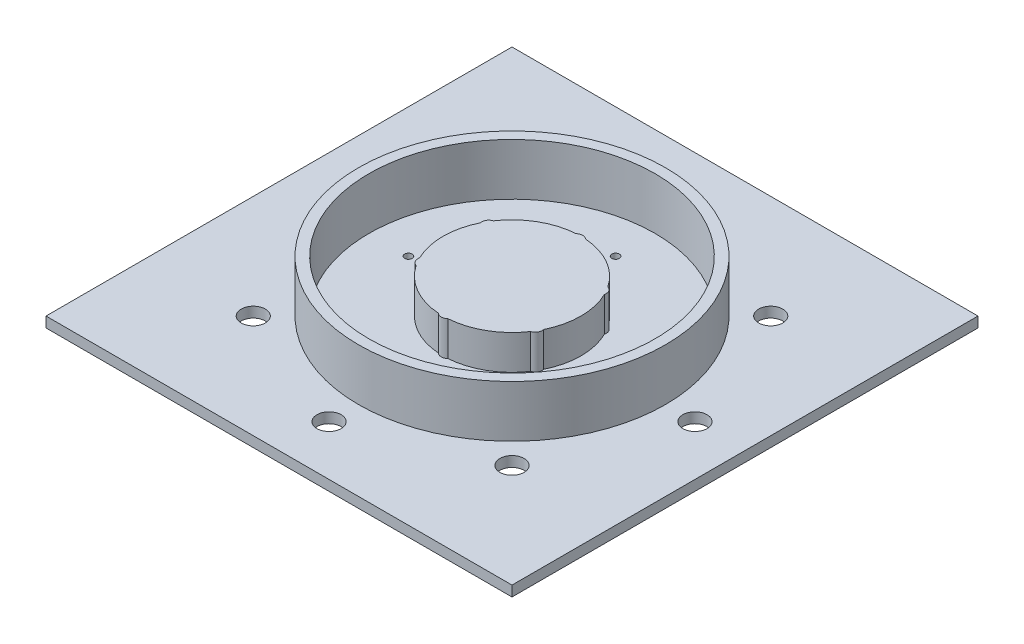
ISO-10303-21;
HEADER;
FILE_DESCRIPTION(('STEP AP214'),'2;1');
FILE_NAME('part.step','',(''),(''),'','','');
FILE_SCHEMA(('AUTOMOTIVE_DESIGN { 1 0 10303 214 1 1 1 1 }'));
ENDSEC;
DATA;
#1=APPLICATION_CONTEXT('core data for automotive mechanical design processes');
#2=APPLICATION_PROTOCOL_DEFINITION('international standard','automotive_design',2000,#1);
#3=PRODUCT_CONTEXT('',#1,'mechanical');
#4=PRODUCT('Part','Part','',(#3));
#5=PRODUCT_RELATED_PRODUCT_CATEGORY('part','',(#4));
#6=PRODUCT_DEFINITION_FORMATION('','',#4);
#7=PRODUCT_DEFINITION_CONTEXT('part definition',#1,'design');
#8=PRODUCT_DEFINITION('design','',#6,#7);
#9=PRODUCT_DEFINITION_SHAPE('','',#8);
#10=(LENGTH_UNIT() NAMED_UNIT(*) SI_UNIT(.MILLI.,.METRE.));
#11=(NAMED_UNIT(*) PLANE_ANGLE_UNIT() SI_UNIT($,.RADIAN.));
#12=(NAMED_UNIT(*) SI_UNIT($,.STERADIAN.) SOLID_ANGLE_UNIT());
#13=UNCERTAINTY_MEASURE_WITH_UNIT(LENGTH_MEASURE(1.E-05),#10,'distance_accuracy_value','');
#14=(GEOMETRIC_REPRESENTATION_CONTEXT(3) GLOBAL_UNCERTAINTY_ASSIGNED_CONTEXT((#13)) GLOBAL_UNIT_ASSIGNED_CONTEXT((#10,
#11,#12)) REPRESENTATION_CONTEXT('',''));
#15=CARTESIAN_POINT('',(0.,0.,0.));
#16=DIRECTION('',(0.,0.,1.));
#17=DIRECTION('',(1.,0.,0.));
#18=AXIS2_PLACEMENT_3D('',#15,#16,#17);
#19=CARTESIAN_POINT('',(0.,3.,0.));
#20=DIRECTION('',(0.,-1.,0.));
#21=DIRECTION('',(0.,0.,-1.));
#22=AXIS2_PLACEMENT_3D('',#19,#20,#21);
#23=PLANE('',#22);
#24=CARTESIAN_POINT('',(67.5,3.,-120.5));
#25=DIRECTION('',(0.,-1.,0.));
#26=DIRECTION('',(0.,0.,-1.));
#27=AXIS2_PLACEMENT_3D('',#24,#25,#26);
#28=CIRCLE('',#27,3.50000000000001);
#29=CARTESIAN_POINT('',(67.5,3.,-124.));
#30=VERTEX_POINT('',#29);
#31=EDGE_CURVE('E884',#30,#30,#28,.T.);
#32=ORIENTED_EDGE('',*,*,#31,.T.);
#33=EDGE_LOOP('',(#32));
#34=FACE_BOUND('',#33,.T.);
#35=CARTESIAN_POINT('',(104.976659402887,3.,-104.976659402887));
#36=DIRECTION('',(0.,-1.,0.));
#37=DIRECTION('',(0.,0.,-1.));
#38=AXIS2_PLACEMENT_3D('',#35,#36,#37);
#39=CIRCLE('',#38,3.50000000000002);
#40=CARTESIAN_POINT('',(104.976659402887,3.,-108.476659402887));
#41=VERTEX_POINT('',#40);
#42=EDGE_CURVE('E887',#41,#41,#39,.T.);
#43=ORIENTED_EDGE('',*,*,#42,.T.);
#44=EDGE_LOOP('',(#43));
#45=FACE_BOUND('',#44,.T.);
#46=CARTESIAN_POINT('',(120.5,3.,-67.5));
#47=DIRECTION('',(0.,-1.,0.));
#48=DIRECTION('',(0.,0.,-1.));
#49=AXIS2_PLACEMENT_3D('',#46,#47,#48);
#50=CIRCLE('',#49,3.50000000000001);
#51=CARTESIAN_POINT('',(120.5,3.,-71.));
#52=VERTEX_POINT('',#51);
#53=EDGE_CURVE('E894',#52,#52,#50,.T.);
#54=ORIENTED_EDGE('',*,*,#53,.T.);
#55=EDGE_LOOP('',(#54));
#56=FACE_BOUND('',#55,.T.);
#57=CARTESIAN_POINT('',(104.976659402887,3.,-30.023340597113));
#58=DIRECTION('',(0.,-1.,0.));
#59=DIRECTION('',(0.,0.,-1.));
#60=AXIS2_PLACEMENT_3D('',#57,#58,#59);
#61=CIRCLE('',#60,3.50000000000001);
#62=CARTESIAN_POINT('',(104.976659402887,3.,-33.523340597113));
#63=VERTEX_POINT('',#62);
#64=EDGE_CURVE('E965',#63,#63,#61,.T.);
#65=ORIENTED_EDGE('',*,*,#64,.T.);
#66=EDGE_LOOP('',(#65));
#67=FACE_BOUND('',#66,.T.);
#68=CARTESIAN_POINT('',(67.5,3.,-14.5));
#69=DIRECTION('',(0.,-1.,0.));
#70=DIRECTION('',(0.,0.,-1.));
#71=AXIS2_PLACEMENT_3D('',#68,#69,#70);
#72=CIRCLE('',#71,3.50000000000002);
#73=CARTESIAN_POINT('',(67.5,3.,-18.));
#74=VERTEX_POINT('',#73);
#75=EDGE_CURVE('E969',#74,#74,#72,.T.);
#76=ORIENTED_EDGE('',*,*,#75,.T.);
#77=EDGE_LOOP('',(#76));
#78=FACE_BOUND('',#77,.T.);
#79=CARTESIAN_POINT('',(30.023340597113,3.,-30.023340597113));
#80=DIRECTION('',(0.,-1.,0.));
#81=DIRECTION('',(0.,0.,-1.));
#82=AXIS2_PLACEMENT_3D('',#79,#80,#81);
#83=CIRCLE('',#82,3.50000000000002);
#84=CARTESIAN_POINT('',(30.023340597113,3.,-33.523340597113));
#85=VERTEX_POINT('',#84);
#86=EDGE_CURVE('E973',#85,#85,#83,.T.);
#87=ORIENTED_EDGE('',*,*,#86,.T.);
#88=EDGE_LOOP('',(#87));
#89=FACE_BOUND('',#88,.T.);
#90=CARTESIAN_POINT('',(14.5,3.,-67.5));
#91=DIRECTION('',(0.,-1.,0.));
#92=DIRECTION('',(0.,0.,-1.));
#93=AXIS2_PLACEMENT_3D('',#90,#91,#92);
#94=CIRCLE('',#93,3.5);
#95=CARTESIAN_POINT('',(14.5,3.,-71.));
#96=VERTEX_POINT('',#95);
#97=EDGE_CURVE('E977',#96,#96,#94,.T.);
#98=ORIENTED_EDGE('',*,*,#97,.T.);
#99=EDGE_LOOP('',(#98));
#100=FACE_BOUND('',#99,.T.);
#101=CARTESIAN_POINT('',(30.023340597113,3.,-104.976659402887));
#102=DIRECTION('',(0.,-1.,0.));
#103=DIRECTION('',(0.,0.,-1.));
#104=AXIS2_PLACEMENT_3D('',#101,#102,#103);
#105=CIRCLE('',#104,3.49999999999999);
#106=CARTESIAN_POINT('',(30.023340597113,3.,-108.476659402887));
#107=VERTEX_POINT('',#106);
#108=EDGE_CURVE('E981',#107,#107,#105,.T.);
#109=ORIENTED_EDGE('',*,*,#108,.T.);
#110=EDGE_LOOP('',(#109));
#111=FACE_BOUND('',#110,.T.);
#112=CARTESIAN_POINT('',(67.5,3.,-67.5));
#113=DIRECTION('',(0.,-1.,0.));
#114=DIRECTION('',(0.,0.,-1.));
#115=AXIS2_PLACEMENT_3D('',#112,#113,#114);
#116=CIRCLE('',#115,44.45);
#117=CARTESIAN_POINT('',(67.5,3.,-111.95));
#118=VERTEX_POINT('',#117);
#119=EDGE_CURVE('E12',#118,#118,#116,.F.);
#120=ORIENTED_EDGE('',*,*,#119,.F.);
#121=EDGE_LOOP('',(#120));
#122=FACE_BOUND('',#121,.T.);
#123=DIRECTION('',(0.,0.,1.));
#124=VECTOR('',#123,1.);
#125=CARTESIAN_POINT('',(0.,3.,0.));
#126=LINE('',#125,#124);
#127=CARTESIAN_POINT('',(0.,3.,-135.));
#128=VERTEX_POINT('',#127);
#129=CARTESIAN_POINT('',(0.,3.,0.));
#130=VERTEX_POINT('',#129);
#131=EDGE_CURVE('E344',#128,#130,#126,.T.);
#132=ORIENTED_EDGE('',*,*,#131,.T.);
#133=DIRECTION('',(1.,0.,0.));
#134=VECTOR('',#133,1.);
#135=CARTESIAN_POINT('',(0.,3.,0.));
#136=LINE('',#135,#134);
#137=CARTESIAN_POINT('',(135.,3.,0.));
#138=VERTEX_POINT('',#137);
#139=EDGE_CURVE('E162',#130,#138,#136,.T.);
#140=ORIENTED_EDGE('',*,*,#139,.T.);
#141=DIRECTION('',(0.,0.,-1.));
#142=VECTOR('',#141,1.);
#143=CARTESIAN_POINT('',(135.,3.,0.));
#144=LINE('',#143,#142);
#145=CARTESIAN_POINT('',(135.,3.,-135.));
#146=VERTEX_POINT('',#145);
#147=EDGE_CURVE('E349',#138,#146,#144,.T.);
#148=ORIENTED_EDGE('',*,*,#147,.T.);
#149=DIRECTION('',(-1.,0.,0.));
#150=VECTOR('',#149,1.);
#151=CARTESIAN_POINT('',(0.,3.,-135.));
#152=LINE('',#151,#150);
#153=EDGE_CURVE('E133',#146,#128,#152,.T.);
#154=ORIENTED_EDGE('',*,*,#153,.T.);
#155=EDGE_LOOP('',(#132,#140,#148,#154));
#156=FACE_BOUND('',#155,.T.);
#157=ADVANCED_FACE('F106',(#34,#45,#56,#67,#78,#89,#100,#111,#122,#156),#23,.F.);
#158=CARTESIAN_POINT('',(0.,3.,0.));
#159=DIRECTION('',(1.,0.,0.));
#160=DIRECTION('',(0.,0.,-1.));
#161=AXIS2_PLACEMENT_3D('',#158,#159,#160);
#162=PLANE('',#161);
#163=DIRECTION('',(0.,0.,1.));
#164=VECTOR('',#163,1.);
#165=CARTESIAN_POINT('',(0.,0.,0.));
#166=LINE('',#165,#164);
#167=CARTESIAN_POINT('',(0.,0.,-135.));
#168=VERTEX_POINT('',#167);
#169=CARTESIAN_POINT('',(0.,0.,0.));
#170=VERTEX_POINT('',#169);
#171=EDGE_CURVE('E291',#168,#170,#166,.T.);
#172=ORIENTED_EDGE('',*,*,#171,.T.);
#173=DIRECTION('',(0.,-1.,0.));
#174=VECTOR('',#173,1.);
#175=CARTESIAN_POINT('',(0.,3.,0.));
#176=LINE('',#175,#174);
#177=EDGE_CURVE('E116',#130,#170,#176,.T.);
#178=ORIENTED_EDGE('',*,*,#177,.F.);
#179=ORIENTED_EDGE('',*,*,#131,.F.);
#180=DIRECTION('',(0.,-1.,0.));
#181=VECTOR('',#180,1.);
#182=CARTESIAN_POINT('',(0.,3.,-135.));
#183=LINE('',#182,#181);
#184=EDGE_CURVE('E354',#128,#168,#183,.T.);
#185=ORIENTED_EDGE('',*,*,#184,.T.);
#186=EDGE_LOOP('',(#172,#178,#179,#185));
#187=FACE_BOUND('',#186,.T.);
#188=ADVANCED_FACE('F108',(#187),#162,.F.);
#189=CARTESIAN_POINT('',(0.,3.,0.));
#190=DIRECTION('',(0.,0.,-1.));
#191=DIRECTION('',(-1.,0.,0.));
#192=AXIS2_PLACEMENT_3D('',#189,#190,#191);
#193=PLANE('',#192);
#194=DIRECTION('',(1.,0.,0.));
#195=VECTOR('',#194,1.);
#196=CARTESIAN_POINT('',(0.,0.,0.));
#197=LINE('',#196,#195);
#198=CARTESIAN_POINT('',(135.,0.,0.));
#199=VERTEX_POINT('',#198);
#200=EDGE_CURVE('E358',#170,#199,#197,.T.);
#201=ORIENTED_EDGE('',*,*,#200,.T.);
#202=DIRECTION('',(0.,-1.,0.));
#203=VECTOR('',#202,1.);
#204=CARTESIAN_POINT('',(135.,3.,0.));
#205=LINE('',#204,#203);
#206=EDGE_CURVE('E371',#138,#199,#205,.T.);
#207=ORIENTED_EDGE('',*,*,#206,.F.);
#208=ORIENTED_EDGE('',*,*,#139,.F.);
#209=ORIENTED_EDGE('',*,*,#177,.T.);
#210=EDGE_LOOP('',(#201,#207,#208,#209));
#211=FACE_BOUND('',#210,.T.);
#212=ADVANCED_FACE('F427',(#211),#193,.F.);
#213=CARTESIAN_POINT('',(135.,3.,0.));
#214=DIRECTION('',(-1.,0.,0.));
#215=DIRECTION('',(0.,0.,1.));
#216=AXIS2_PLACEMENT_3D('',#213,#214,#215);
#217=PLANE('',#216);
#218=DIRECTION('',(0.,0.,-1.));
#219=VECTOR('',#218,1.);
#220=CARTESIAN_POINT('',(135.,0.,0.));
#221=LINE('',#220,#219);
#222=CARTESIAN_POINT('',(135.,0.,-135.));
#223=VERTEX_POINT('',#222);
#224=EDGE_CURVE('E361',#199,#223,#221,.T.);
#225=ORIENTED_EDGE('',*,*,#224,.T.);
#226=DIRECTION('',(0.,-1.,0.));
#227=VECTOR('',#226,1.);
#228=CARTESIAN_POINT('',(135.,3.,-135.));
#229=LINE('',#228,#227);
#230=EDGE_CURVE('E368',#146,#223,#229,.T.);
#231=ORIENTED_EDGE('',*,*,#230,.F.);
#232=ORIENTED_EDGE('',*,*,#147,.F.);
#233=ORIENTED_EDGE('',*,*,#206,.T.);
#234=EDGE_LOOP('',(#225,#231,#232,#233));
#235=FACE_BOUND('',#234,.T.);
#236=ADVANCED_FACE('F432',(#235),#217,.F.);
#237=CARTESIAN_POINT('',(0.,3.,-135.));
#238=DIRECTION('',(0.,0.,1.));
#239=DIRECTION('',(1.,0.,0.));
#240=AXIS2_PLACEMENT_3D('',#237,#238,#239);
#241=PLANE('',#240);
#242=DIRECTION('',(-1.,0.,0.));
#243=VECTOR('',#242,1.);
#244=CARTESIAN_POINT('',(0.,0.,-135.));
#245=LINE('',#244,#243);
#246=EDGE_CURVE('E154',#223,#168,#245,.T.);
#247=ORIENTED_EDGE('',*,*,#246,.T.);
#248=ORIENTED_EDGE('',*,*,#184,.F.);
#249=ORIENTED_EDGE('',*,*,#153,.F.);
#250=ORIENTED_EDGE('',*,*,#230,.T.);
#251=EDGE_LOOP('',(#247,#248,#249,#250));
#252=FACE_BOUND('',#251,.T.);
#253=ADVANCED_FACE('F436',(#252),#241,.F.);
#254=CARTESIAN_POINT('',(0.,0.,0.));
#255=DIRECTION('',(0.,-1.,0.));
#256=DIRECTION('',(0.,0.,-1.));
#257=AXIS2_PLACEMENT_3D('',#254,#255,#256);
#258=PLANE('',#257);
#259=CARTESIAN_POINT('',(67.5,0.,-120.5));
#260=DIRECTION('',(0.,1.,0.));
#261=DIRECTION('',(0.,0.,1.));
#262=AXIS2_PLACEMENT_3D('',#259,#260,#261);
#263=CIRCLE('',#262,3.50000000000001);
#264=CARTESIAN_POINT('',(67.5,0.,-117.));
#265=VERTEX_POINT('',#264);
#266=EDGE_CURVE('E881',#265,#265,#263,.T.);
#267=ORIENTED_EDGE('',*,*,#266,.T.);
#268=EDGE_LOOP('',(#267));
#269=FACE_BOUND('',#268,.T.);
#270=CARTESIAN_POINT('',(104.976659402887,0.,-104.976659402887));
#271=DIRECTION('',(0.,1.,0.));
#272=DIRECTION('',(0.,0.,1.));
#273=AXIS2_PLACEMENT_3D('',#270,#271,#272);
#274=CIRCLE('',#273,3.50000000000002);
#275=CARTESIAN_POINT('',(104.976659402887,0.,-101.476659402887));
#276=VERTEX_POINT('',#275);
#277=EDGE_CURVE('E1009',#276,#276,#274,.T.);
#278=ORIENTED_EDGE('',*,*,#277,.T.);
#279=EDGE_LOOP('',(#278));
#280=FACE_BOUND('',#279,.T.);
#281=CARTESIAN_POINT('',(120.5,0.,-67.5));
#282=DIRECTION('',(0.,1.,0.));
#283=DIRECTION('',(0.,0.,1.));
#284=AXIS2_PLACEMENT_3D('',#281,#282,#283);
#285=CIRCLE('',#284,3.50000000000001);
#286=CARTESIAN_POINT('',(120.5,0.,-64.));
#287=VERTEX_POINT('',#286);
#288=EDGE_CURVE('E1005',#287,#287,#285,.T.);
#289=ORIENTED_EDGE('',*,*,#288,.T.);
#290=EDGE_LOOP('',(#289));
#291=FACE_BOUND('',#290,.T.);
#292=CARTESIAN_POINT('',(104.976659402887,0.,-30.023340597113));
#293=DIRECTION('',(0.,1.,0.));
#294=DIRECTION('',(0.,0.,1.));
#295=AXIS2_PLACEMENT_3D('',#292,#293,#294);
#296=CIRCLE('',#295,3.50000000000001);
#297=CARTESIAN_POINT('',(104.976659402887,0.,-26.523340597113));
#298=VERTEX_POINT('',#297);
#299=EDGE_CURVE('E1001',#298,#298,#296,.T.);
#300=ORIENTED_EDGE('',*,*,#299,.T.);
#301=EDGE_LOOP('',(#300));
#302=FACE_BOUND('',#301,.T.);
#303=CARTESIAN_POINT('',(67.5,0.,-14.5));
#304=DIRECTION('',(0.,1.,0.));
#305=DIRECTION('',(0.,0.,1.));
#306=AXIS2_PLACEMENT_3D('',#303,#304,#305);
#307=CIRCLE('',#306,3.50000000000002);
#308=CARTESIAN_POINT('',(67.5,0.,-11.));
#309=VERTEX_POINT('',#308);
#310=EDGE_CURVE('E997',#309,#309,#307,.T.);
#311=ORIENTED_EDGE('',*,*,#310,.T.);
#312=EDGE_LOOP('',(#311));
#313=FACE_BOUND('',#312,.T.);
#314=CARTESIAN_POINT('',(30.023340597113,0.,-30.023340597113));
#315=DIRECTION('',(0.,1.,0.));
#316=DIRECTION('',(0.,0.,1.));
#317=AXIS2_PLACEMENT_3D('',#314,#315,#316);
#318=CIRCLE('',#317,3.50000000000002);
#319=CARTESIAN_POINT('',(30.023340597113,0.,-26.523340597113));
#320=VERTEX_POINT('',#319);
#321=EDGE_CURVE('E993',#320,#320,#318,.T.);
#322=ORIENTED_EDGE('',*,*,#321,.T.);
#323=EDGE_LOOP('',(#322));
#324=FACE_BOUND('',#323,.T.);
#325=CARTESIAN_POINT('',(14.5,0.,-67.5));
#326=DIRECTION('',(0.,1.,0.));
#327=DIRECTION('',(0.,0.,1.));
#328=AXIS2_PLACEMENT_3D('',#325,#326,#327);
#329=CIRCLE('',#328,3.5);
#330=CARTESIAN_POINT('',(14.5,0.,-64.));
#331=VERTEX_POINT('',#330);
#332=EDGE_CURVE('E989',#331,#331,#329,.T.);
#333=ORIENTED_EDGE('',*,*,#332,.T.);
#334=EDGE_LOOP('',(#333));
#335=FACE_BOUND('',#334,.T.);
#336=CARTESIAN_POINT('',(30.023340597113,0.,-104.976659402887));
#337=DIRECTION('',(0.,1.,0.));
#338=DIRECTION('',(0.,0.,1.));
#339=AXIS2_PLACEMENT_3D('',#336,#337,#338);
#340=CIRCLE('',#339,3.49999999999999);
#341=CARTESIAN_POINT('',(30.023340597113,0.,-101.476659402887));
#342=VERTEX_POINT('',#341);
#343=EDGE_CURVE('E985',#342,#342,#340,.T.);
#344=ORIENTED_EDGE('',*,*,#343,.T.);
#345=EDGE_LOOP('',(#344));
#346=FACE_BOUND('',#345,.T.);
#347=CARTESIAN_POINT('',(67.5,0.,-97.5));
#348=DIRECTION('',(0.,1.,0.));
#349=DIRECTION('',(0.,0.,1.));
#350=AXIS2_PLACEMENT_3D('',#347,#348,#349);
#351=CIRCLE('',#350,1.10000000000001);
#352=CARTESIAN_POINT('',(67.5,0.,-96.4));
#353=VERTEX_POINT('',#352);
#354=EDGE_CURVE('E382',#353,#353,#351,.T.);
#355=ORIENTED_EDGE('',*,*,#354,.T.);
#356=EDGE_LOOP('',(#355));
#357=FACE_BOUND('',#356,.T.);
#358=CARTESIAN_POINT('',(97.5,0.,-67.5));
#359=DIRECTION('',(0.,1.,0.));
#360=DIRECTION('',(0.,0.,1.));
#361=AXIS2_PLACEMENT_3D('',#358,#359,#360);
#362=CIRCLE('',#361,1.10000000000001);
#363=CARTESIAN_POINT('',(97.5,0.,-66.4));
#364=VERTEX_POINT('',#363);
#365=EDGE_CURVE('E901',#364,#364,#362,.T.);
#366=ORIENTED_EDGE('',*,*,#365,.T.);
#367=EDGE_LOOP('',(#366));
#368=FACE_BOUND('',#367,.T.);
#369=CARTESIAN_POINT('',(67.5,0.,-37.5));
#370=DIRECTION('',(0.,1.,0.));
#371=DIRECTION('',(0.,0.,1.));
#372=AXIS2_PLACEMENT_3D('',#369,#370,#371);
#373=CIRCLE('',#372,1.10000000000001);
#374=CARTESIAN_POINT('',(67.5,0.,-36.4));
#375=VERTEX_POINT('',#374);
#376=EDGE_CURVE('E892',#375,#375,#373,.T.);
#377=ORIENTED_EDGE('',*,*,#376,.T.);
#378=EDGE_LOOP('',(#377));
#379=FACE_BOUND('',#378,.T.);
#380=CARTESIAN_POINT('',(37.5,0.,-67.5));
#381=DIRECTION('',(0.,1.,0.));
#382=DIRECTION('',(0.,0.,1.));
#383=AXIS2_PLACEMENT_3D('',#380,#381,#382);
#384=CIRCLE('',#383,1.1);
#385=CARTESIAN_POINT('',(37.5,0.,-66.4));
#386=VERTEX_POINT('',#385);
#387=EDGE_CURVE('E886',#386,#386,#384,.T.);
#388=ORIENTED_EDGE('',*,*,#387,.T.);
#389=EDGE_LOOP('',(#388));
#390=FACE_BOUND('',#389,.T.);
#391=ORIENTED_EDGE('',*,*,#171,.F.);
#392=ORIENTED_EDGE('',*,*,#246,.F.);
#393=ORIENTED_EDGE('',*,*,#224,.F.);
#394=ORIENTED_EDGE('',*,*,#200,.F.);
#395=EDGE_LOOP('',(#391,#392,#393,#394));
#396=FACE_BOUND('',#395,.T.);
#397=ADVANCED_FACE('F434',(#269,#280,#291,#302,#313,#324,#335,#346,#357,#368,#379,#390,#396),
#258,.T.);
#398=CARTESIAN_POINT('',(67.5,18.,-67.5));
#399=DIRECTION('',(0.,1.,0.));
#400=DIRECTION('',(0.,0.,1.));
#401=AXIS2_PLACEMENT_3D('',#398,#399,#400);
#402=PLANE('',#401);
#403=CARTESIAN_POINT('',(67.5,18.,-67.5));
#404=DIRECTION('',(0.,1.,0.));
#405=DIRECTION('',(0.,0.,1.));
#406=AXIS2_PLACEMENT_3D('',#403,#404,#405);
#407=CIRCLE('',#406,44.45);
#408=CARTESIAN_POINT('',(67.5,18.,-23.05));
#409=VERTEX_POINT('',#408);
#410=EDGE_CURVE('E339',#409,#409,#407,.T.);
#411=ORIENTED_EDGE('',*,*,#410,.T.);
#412=EDGE_LOOP('',(#411));
#413=FACE_BOUND('',#412,.T.);
#414=CARTESIAN_POINT('',(67.5,18.,-67.5));
#415=DIRECTION('',(0.,1.,0.));
#416=DIRECTION('',(0.,0.,1.));
#417=AXIS2_PLACEMENT_3D('',#414,#415,#416);
#418=CIRCLE('',#417,41.45);
#419=CARTESIAN_POINT('',(67.5,18.,-26.05));
#420=VERTEX_POINT('',#419);
#421=EDGE_CURVE('E397',#420,#420,#418,.T.);
#422=ORIENTED_EDGE('',*,*,#421,.F.);
#423=EDGE_LOOP('',(#422));
#424=FACE_BOUND('',#423,.T.);
#425=ADVANCED_FACE('F409',(#413,#424),#402,.T.);
#426=CARTESIAN_POINT('',(67.5,18.,-67.5));
#427=DIRECTION('',(0.,-1.,0.));
#428=DIRECTION('',(0.,0.,-1.));
#429=AXIS2_PLACEMENT_3D('',#426,#427,#428);
#430=CYLINDRICAL_SURFACE('',#429,44.45);
#431=ORIENTED_EDGE('',*,*,#410,.F.);
#432=EDGE_LOOP('',(#431));
#433=FACE_BOUND('',#432,.T.);
#434=ORIENTED_EDGE('',*,*,#119,.T.);
#435=EDGE_LOOP('',(#434));
#436=FACE_BOUND('',#435,.T.);
#437=ADVANCED_FACE('F412',(#433,#436),#430,.T.);
#438=CARTESIAN_POINT('',(67.5,18.,-67.5));
#439=DIRECTION('',(0.,-1.,0.));
#440=DIRECTION('',(0.,0.,-1.));
#441=AXIS2_PLACEMENT_3D('',#438,#439,#440);
#442=CYLINDRICAL_SURFACE('',#441,41.45);
#443=ORIENTED_EDGE('',*,*,#421,.T.);
#444=EDGE_LOOP('',(#443));
#445=FACE_BOUND('',#444,.T.);
#446=CARTESIAN_POINT('',(67.5,3.,-67.5));
#447=DIRECTION('',(0.,1.,0.));
#448=DIRECTION('',(0.,0.,1.));
#449=AXIS2_PLACEMENT_3D('',#446,#447,#448);
#450=CIRCLE('',#449,41.45);
#451=CARTESIAN_POINT('',(67.5,3.,-26.05));
#452=VERTEX_POINT('',#451);
#453=EDGE_CURVE('E392',#452,#452,#450,.T.);
#454=ORIENTED_EDGE('',*,*,#453,.F.);
#455=EDGE_LOOP('',(#454));
#456=FACE_BOUND('',#455,.T.);
#457=ADVANCED_FACE('F415',(#445,#456),#442,.F.);
#458=CARTESIAN_POINT('',(0.,13.,0.));
#459=DIRECTION('',(0.,1.,0.));
#460=DIRECTION('',(0.,0.,1.));
#461=AXIS2_PLACEMENT_3D('',#458,#459,#460);
#462=PLANE('',#461);
#463=CARTESIAN_POINT('',(67.5,13.,-67.5));
#464=DIRECTION('',(0.,1.,0.));
#465=DIRECTION('',(0.,0.,1.));
#466=AXIS2_PLACEMENT_3D('',#463,#464,#465);
#467=CIRCLE('',#466,20.);
#468=CARTESIAN_POINT('',(66.1253528243362,13.,-87.4527027027027));
#469=VERTEX_POINT('',#468);
#470=CARTESIAN_POINT('',(50.9077761731329,13.,-78.6668307267167));
#471=VERTEX_POINT('',#470);
#472=EDGE_CURVE('E247',#469,#471,#467,.T.);
#473=ORIENTED_EDGE('',*,*,#472,.T.);
#474=CARTESIAN_POINT('',(51.4785300299882,13.,-76.7499999999997));
#475=DIRECTION('',(0.,-1.,0.));
#476=DIRECTION('',(0.,0.,-1.));
#477=AXIS2_PLACEMENT_3D('',#474,#475,#476);
#478=CIRCLE('',#477,1.99999999999999);
#479=CARTESIAN_POINT('',(49.5331289974691,13.,-76.2858719759859));
#480=VERTEX_POINT('',#479);
#481=EDGE_CURVE('E325',#480,#471,#478,.T.);
#482=ORIENTED_EDGE('',*,*,#481,.F.);
#483=CARTESIAN_POINT('',(49.5331289974694,13.,-58.7141280240134));
#484=VERTEX_POINT('',#483);
#485=EDGE_CURVE('E267',#480,#484,#467,.T.);
#486=ORIENTED_EDGE('',*,*,#485,.T.);
#487=CARTESIAN_POINT('',(51.4785300299886,13.,-58.2499999999997));
#488=DIRECTION('',(0.,-1.,0.));
#489=DIRECTION('',(0.,0.,-1.));
#490=AXIS2_PLACEMENT_3D('',#487,#488,#489);
#491=CIRCLE('',#490,1.99999999999999);
#492=CARTESIAN_POINT('',(50.9077761731333,13.,-56.3331692732827));
#493=VERTEX_POINT('',#492);
#494=EDGE_CURVE('E283',#493,#484,#491,.T.);
#495=ORIENTED_EDGE('',*,*,#494,.F.);
#496=CARTESIAN_POINT('',(66.1253528243373,13.,-47.5472972972972));
#497=VERTEX_POINT('',#496);
#498=EDGE_CURVE('E924',#493,#497,#467,.T.);
#499=ORIENTED_EDGE('',*,*,#498,.T.);
#500=CARTESIAN_POINT('',(67.500000000001,13.,-49.));
#501=DIRECTION('',(0.,-1.,0.));
#502=DIRECTION('',(0.,0.,-1.));
#503=AXIS2_PLACEMENT_3D('',#500,#501,#502);
#504=CIRCLE('',#503,1.99999999999999);
#505=CARTESIAN_POINT('',(68.8746471756647,13.,-47.5472972972974));
#506=VERTEX_POINT('',#505);
#507=EDGE_CURVE('E275',#506,#497,#504,.T.);
#508=ORIENTED_EDGE('',*,*,#507,.F.);
#509=CARTESIAN_POINT('',(84.0922238268675,13.,-56.3331692732839));
#510=VERTEX_POINT('',#509);
#511=EDGE_CURVE('E927',#506,#510,#467,.T.);
#512=ORIENTED_EDGE('',*,*,#511,.T.);
#513=CARTESIAN_POINT('',(83.5214699700129,13.,-58.2500000000004));
#514=DIRECTION('',(0.,-1.,0.));
#515=DIRECTION('',(0.,0.,-1.));
#516=AXIS2_PLACEMENT_3D('',#513,#514,#515);
#517=CIRCLE('',#516,1.99999999999997);
#518=CARTESIAN_POINT('',(85.4668710025311,13.,-58.7141280240146));
#519=VERTEX_POINT('',#518);
#520=EDGE_CURVE('E299',#519,#510,#517,.T.);
#521=ORIENTED_EDGE('',*,*,#520,.F.);
#522=CARTESIAN_POINT('',(85.4668710025307,13.,-76.2858719759863));
#523=VERTEX_POINT('',#522);
#524=EDGE_CURVE('E244',#519,#523,#467,.T.);
#525=ORIENTED_EDGE('',*,*,#524,.T.);
#526=CARTESIAN_POINT('',(83.5214699700124,13.,-76.7500000000005));
#527=DIRECTION('',(0.,-1.,0.));
#528=DIRECTION('',(0.,0.,-1.));
#529=AXIS2_PLACEMENT_3D('',#526,#527,#528);
#530=CIRCLE('',#529,1.99999999999999);
#531=CARTESIAN_POINT('',(84.092223826867,13.,-78.6668307267169));
#532=VERTEX_POINT('',#531);
#533=EDGE_CURVE('E241',#532,#523,#530,.T.);
#534=ORIENTED_EDGE('',*,*,#533,.F.);
#535=CARTESIAN_POINT('',(68.8746471756637,13.,-87.4527027027027));
#536=VERTEX_POINT('',#535);
#537=EDGE_CURVE('E233',#532,#536,#467,.T.);
#538=ORIENTED_EDGE('',*,*,#537,.T.);
#539=CARTESIAN_POINT('',(67.5,13.,-86.));
#540=DIRECTION('',(0.,1.,0.));
#541=DIRECTION('',(0.,0.,1.));
#542=AXIS2_PLACEMENT_3D('',#539,#540,#541);
#543=CIRCLE('',#542,1.99999999999999);
#544=EDGE_CURVE('E238',#469,#536,#543,.F.);
#545=ORIENTED_EDGE('',*,*,#544,.F.);
#546=EDGE_LOOP('',(#473,#482,#486,#495,#499,#508,#512,#521,#525,#534,#538,#545));
#547=FACE_BOUND('',#546,.T.);
#548=ADVANCED_FACE('F236',(#547),#462,.T.);
#549=CARTESIAN_POINT('',(51.4785300299882,13.,-76.7499999999997));
#550=DIRECTION('',(0.,-1.,0.));
#551=DIRECTION('',(0.,0.,-1.));
#552=AXIS2_PLACEMENT_3D('',#549,#550,#551);
#553=CYLINDRICAL_SURFACE('',#552,1.99999999999999);
#554=CARTESIAN_POINT('',(51.4785300299882,3.,-76.7499999999997));
#555=DIRECTION('',(0.,-1.,0.));
#556=DIRECTION('',(0.,0.,-1.));
#557=AXIS2_PLACEMENT_3D('',#554,#555,#556);
#558=CIRCLE('',#557,1.99999999999999);
#559=CARTESIAN_POINT('',(49.5331289974691,3.,-76.2858719759859));
#560=VERTEX_POINT('',#559);
#561=CARTESIAN_POINT('',(50.9077761731329,3.,-78.6668307267167));
#562=VERTEX_POINT('',#561);
#563=EDGE_CURVE('E335',#560,#562,#558,.T.);
#564=ORIENTED_EDGE('',*,*,#563,.F.);
#565=DIRECTION('',(0.,-1.,0.));
#566=VECTOR('',#565,1.);
#567=CARTESIAN_POINT('',(49.5331289974695,13.,-76.2858719759857));
#568=LINE('',#567,#566);
#569=EDGE_CURVE('E257',#480,#560,#568,.T.);
#570=ORIENTED_EDGE('',*,*,#569,.F.);
#571=ORIENTED_EDGE('',*,*,#481,.T.);
#572=DIRECTION('',(0.,-1.,0.));
#573=VECTOR('',#572,1.);
#574=CARTESIAN_POINT('',(50.9077761731333,13.,-78.6668307267164));
#575=LINE('',#574,#573);
#576=EDGE_CURVE('E329',#471,#562,#575,.T.);
#577=ORIENTED_EDGE('',*,*,#576,.T.);
#578=EDGE_LOOP('',(#564,#570,#571,#577));
#579=FACE_BOUND('',#578,.T.);
#580=ADVANCED_FACE('F494',(#579),#553,.T.);
#581=CARTESIAN_POINT('',(67.5,13.,-67.5));
#582=DIRECTION('',(0.,-1.,0.));
#583=DIRECTION('',(0.,0.,-1.));
#584=AXIS2_PLACEMENT_3D('',#581,#582,#583);
#585=CYLINDRICAL_SURFACE('',#584,20.);
#586=DIRECTION('',(0.,-1.,0.));
#587=VECTOR('',#586,1.);
#588=CARTESIAN_POINT('',(49.5331289974699,13.,-58.7141280240136));
#589=LINE('',#588,#587);
#590=CARTESIAN_POINT('',(49.5331289974694,3.,-58.7141280240134));
#591=VERTEX_POINT('',#590);
#592=EDGE_CURVE('E288',#484,#591,#589,.T.);
#593=ORIENTED_EDGE('',*,*,#592,.F.);
#594=ORIENTED_EDGE('',*,*,#485,.F.);
#595=ORIENTED_EDGE('',*,*,#569,.T.);
#596=CARTESIAN_POINT('',(67.5,3.,-67.5));
#597=DIRECTION('',(0.,1.,0.));
#598=DIRECTION('',(0.,0.,1.));
#599=AXIS2_PLACEMENT_3D('',#596,#597,#598);
#600=CIRCLE('',#599,20.);
#601=EDGE_CURVE('E272',#560,#591,#600,.T.);
#602=ORIENTED_EDGE('',*,*,#601,.T.);
#603=EDGE_LOOP('',(#593,#594,#595,#602));
#604=FACE_BOUND('',#603,.T.);
#605=ADVANCED_FACE('F489',(#604),#585,.T.);
#606=CARTESIAN_POINT('',(51.4785300299886,13.,-58.2499999999997));
#607=DIRECTION('',(0.,-1.,0.));
#608=DIRECTION('',(0.,0.,-1.));
#609=AXIS2_PLACEMENT_3D('',#606,#607,#608);
#610=CYLINDRICAL_SURFACE('',#609,1.99999999999999);
#611=CARTESIAN_POINT('',(51.4785300299886,3.,-58.2499999999997));
#612=DIRECTION('',(0.,-1.,0.));
#613=DIRECTION('',(0.,0.,-1.));
#614=AXIS2_PLACEMENT_3D('',#611,#612,#613);
#615=CIRCLE('',#614,1.99999999999999);
#616=CARTESIAN_POINT('',(50.9077761731333,3.,-56.3331692732827));
#617=VERTEX_POINT('',#616);
#618=EDGE_CURVE('E295',#617,#591,#615,.T.);
#619=ORIENTED_EDGE('',*,*,#618,.F.);
#620=DIRECTION('',(0.,-1.,0.));
#621=VECTOR('',#620,1.);
#622=CARTESIAN_POINT('',(50.9077761731337,13.,-56.333169273283));
#623=LINE('',#622,#621);
#624=EDGE_CURVE('E300',#493,#617,#623,.T.);
#625=ORIENTED_EDGE('',*,*,#624,.F.);
#626=ORIENTED_EDGE('',*,*,#494,.T.);
#627=ORIENTED_EDGE('',*,*,#592,.T.);
#628=EDGE_LOOP('',(#619,#625,#626,#627));
#629=FACE_BOUND('',#628,.T.);
#630=ADVANCED_FACE('F493',(#629),#610,.T.);
#631=DIRECTION('',(0.,-1.,0.));
#632=VECTOR('',#631,1.);
#633=CARTESIAN_POINT('',(66.1253528243373,13.,-47.5472972972972));
#634=LINE('',#633,#632);
#635=CARTESIAN_POINT('',(66.1253528243373,3.,-47.5472972972972));
#636=VERTEX_POINT('',#635);
#637=EDGE_CURVE('E287',#497,#636,#634,.T.);
#638=ORIENTED_EDGE('',*,*,#637,.F.);
#639=ORIENTED_EDGE('',*,*,#498,.F.);
#640=ORIENTED_EDGE('',*,*,#624,.T.);
#641=EDGE_CURVE('E946',#617,#636,#600,.T.);
#642=ORIENTED_EDGE('',*,*,#641,.T.);
#643=EDGE_LOOP('',(#638,#639,#640,#642));
#644=FACE_BOUND('',#643,.T.);
#645=ADVANCED_FACE('F498',(#644),#585,.T.);
#646=CARTESIAN_POINT('',(67.500000000001,13.,-49.));
#647=DIRECTION('',(0.,-1.,0.));
#648=DIRECTION('',(0.,0.,-1.));
#649=AXIS2_PLACEMENT_3D('',#646,#647,#648);
#650=CYLINDRICAL_SURFACE('',#649,1.99999999999999);
#651=CARTESIAN_POINT('',(67.500000000001,3.,-49.));
#652=DIRECTION('',(0.,-1.,0.));
#653=DIRECTION('',(0.,0.,-1.));
#654=AXIS2_PLACEMENT_3D('',#651,#652,#653);
#655=CIRCLE('',#654,1.99999999999999);
#656=CARTESIAN_POINT('',(68.8746471756647,3.,-47.5472972972974));
#657=VERTEX_POINT('',#656);
#658=EDGE_CURVE('E279',#657,#636,#655,.T.);
#659=ORIENTED_EDGE('',*,*,#658,.F.);
#660=DIRECTION('',(0.,-1.,0.));
#661=VECTOR('',#660,1.);
#662=CARTESIAN_POINT('',(68.8746471756647,13.,-47.5472972972974));
#663=LINE('',#662,#661);
#664=EDGE_CURVE('E284',#506,#657,#663,.T.);
#665=ORIENTED_EDGE('',*,*,#664,.F.);
#666=ORIENTED_EDGE('',*,*,#507,.T.);
#667=ORIENTED_EDGE('',*,*,#637,.T.);
#668=EDGE_LOOP('',(#659,#665,#666,#667));
#669=FACE_BOUND('',#668,.T.);
#670=ADVANCED_FACE('F524',(#669),#650,.T.);
#671=ORIENTED_EDGE('',*,*,#511,.F.);
#672=ORIENTED_EDGE('',*,*,#664,.T.);
#673=CARTESIAN_POINT('',(84.0922238268675,3.,-56.3331692732839));
#674=VERTEX_POINT('',#673);
#675=EDGE_CURVE('E943',#657,#674,#600,.T.);
#676=ORIENTED_EDGE('',*,*,#675,.T.);
#677=DIRECTION('',(0.,-1.,0.));
#678=VECTOR('',#677,1.);
#679=CARTESIAN_POINT('',(84.0922238268679,13.,-56.3331692732837));
#680=LINE('',#679,#678);
#681=EDGE_CURVE('E303',#510,#674,#680,.T.);
#682=ORIENTED_EDGE('',*,*,#681,.F.);
#683=EDGE_LOOP('',(#671,#672,#676,#682));
#684=FACE_BOUND('',#683,.T.);
#685=ADVANCED_FACE('F497',(#684),#585,.T.);
#686=CARTESIAN_POINT('',(83.5214699700129,13.,-58.2500000000004));
#687=DIRECTION('',(0.,-1.,0.));
#688=DIRECTION('',(0.,0.,-1.));
#689=AXIS2_PLACEMENT_3D('',#686,#687,#688);
#690=CYLINDRICAL_SURFACE('',#689,1.99999999999997);
#691=CARTESIAN_POINT('',(83.5214699700129,3.,-58.2500000000004));
#692=DIRECTION('',(0.,-1.,0.));
#693=DIRECTION('',(0.,0.,-1.));
#694=AXIS2_PLACEMENT_3D('',#691,#692,#693);
#695=CIRCLE('',#694,1.99999999999997);
#696=CARTESIAN_POINT('',(85.4668710025311,3.,-58.7141280240146));
#697=VERTEX_POINT('',#696);
#698=EDGE_CURVE('E309',#697,#674,#695,.T.);
#699=ORIENTED_EDGE('',*,*,#698,.F.);
#700=DIRECTION('',(0.,-1.,0.));
#701=VECTOR('',#700,1.);
#702=CARTESIAN_POINT('',(85.4668710025315,13.,-58.7141280240144));
#703=LINE('',#702,#701);
#704=EDGE_CURVE('E313',#519,#697,#703,.T.);
#705=ORIENTED_EDGE('',*,*,#704,.F.);
#706=ORIENTED_EDGE('',*,*,#520,.T.);
#707=ORIENTED_EDGE('',*,*,#681,.T.);
#708=EDGE_LOOP('',(#699,#705,#706,#707));
#709=FACE_BOUND('',#708,.T.);
#710=ADVANCED_FACE('F551',(#709),#690,.T.);
#711=ORIENTED_EDGE('',*,*,#524,.F.);
#712=ORIENTED_EDGE('',*,*,#704,.T.);
#713=CARTESIAN_POINT('',(85.4668710025307,3.,-76.2858719759863));
#714=VERTEX_POINT('',#713);
#715=EDGE_CURVE('E939',#697,#714,#600,.T.);
#716=ORIENTED_EDGE('',*,*,#715,.T.);
#717=DIRECTION('',(0.,-1.,0.));
#718=VECTOR('',#717,1.);
#719=CARTESIAN_POINT('',(85.4668710025311,13.,-76.2858719759865));
#720=LINE('',#719,#718);
#721=EDGE_CURVE('E316',#523,#714,#720,.T.);
#722=ORIENTED_EDGE('',*,*,#721,.F.);
#723=EDGE_LOOP('',(#711,#712,#716,#722));
#724=FACE_BOUND('',#723,.T.);
#725=ADVANCED_FACE('F553',(#724),#585,.T.);
#726=CARTESIAN_POINT('',(83.5214699700124,13.,-76.7500000000005));
#727=DIRECTION('',(0.,-1.,0.));
#728=DIRECTION('',(0.,0.,-1.));
#729=AXIS2_PLACEMENT_3D('',#726,#727,#728);
#730=CYLINDRICAL_SURFACE('',#729,1.99999999999999);
#731=CARTESIAN_POINT('',(83.5214699700124,3.,-76.7500000000005));
#732=DIRECTION('',(0.,-1.,0.));
#733=DIRECTION('',(0.,0.,-1.));
#734=AXIS2_PLACEMENT_3D('',#731,#732,#733);
#735=CIRCLE('',#734,1.99999999999999);
#736=CARTESIAN_POINT('',(84.092223826867,3.,-78.6668307267169));
#737=VERTEX_POINT('',#736);
#738=EDGE_CURVE('E321',#737,#714,#735,.T.);
#739=ORIENTED_EDGE('',*,*,#738,.F.);
#740=DIRECTION('',(0.,-1.,0.));
#741=VECTOR('',#740,1.);
#742=CARTESIAN_POINT('',(84.0922238268673,13.,-78.6668307267171));
#743=LINE('',#742,#741);
#744=EDGE_CURVE('E326',#532,#737,#743,.T.);
#745=ORIENTED_EDGE('',*,*,#744,.F.);
#746=ORIENTED_EDGE('',*,*,#533,.T.);
#747=ORIENTED_EDGE('',*,*,#721,.T.);
#748=EDGE_LOOP('',(#739,#745,#746,#747));
#749=FACE_BOUND('',#748,.T.);
#750=ADVANCED_FACE('F579',(#749),#730,.T.);
#751=ORIENTED_EDGE('',*,*,#537,.F.);
#752=ORIENTED_EDGE('',*,*,#744,.T.);
#753=CARTESIAN_POINT('',(68.8746471756637,3.,-87.4527027027027));
#754=VERTEX_POINT('',#753);
#755=EDGE_CURVE('E252',#737,#754,#600,.T.);
#756=ORIENTED_EDGE('',*,*,#755,.T.);
#757=DIRECTION('',(0.,-1.,0.));
#758=VECTOR('',#757,1.);
#759=CARTESIAN_POINT('',(68.8746471756637,13.,-87.4527027027027));
#760=LINE('',#759,#758);
#761=EDGE_CURVE('E249',#536,#754,#760,.T.);
#762=ORIENTED_EDGE('',*,*,#761,.F.);
#763=EDGE_LOOP('',(#751,#752,#756,#762));
#764=FACE_BOUND('',#763,.T.);
#765=ADVANCED_FACE('F250',(#764),#585,.T.);
#766=CARTESIAN_POINT('',(67.5,13.,-86.));
#767=DIRECTION('',(0.,-1.,0.));
#768=DIRECTION('',(0.,0.,-1.));
#769=AXIS2_PLACEMENT_3D('',#766,#767,#768);
#770=CYLINDRICAL_SURFACE('',#769,1.99999999999999);
#771=CARTESIAN_POINT('',(67.5,3.,-86.));
#772=DIRECTION('',(0.,1.,0.));
#773=DIRECTION('',(0.,0.,1.));
#774=AXIS2_PLACEMENT_3D('',#771,#772,#773);
#775=CIRCLE('',#774,1.99999999999999);
#776=CARTESIAN_POINT('',(66.1253528243362,3.,-87.4527027027027));
#777=VERTEX_POINT('',#776);
#778=EDGE_CURVE('E245',#777,#754,#775,.F.);
#779=ORIENTED_EDGE('',*,*,#778,.F.);
#780=DIRECTION('',(0.,-1.,0.));
#781=VECTOR('',#780,1.);
#782=CARTESIAN_POINT('',(66.1253528243362,13.,-87.4527027027027));
#783=LINE('',#782,#781);
#784=EDGE_CURVE('E258',#469,#777,#783,.T.);
#785=ORIENTED_EDGE('',*,*,#784,.F.);
#786=ORIENTED_EDGE('',*,*,#544,.T.);
#787=ORIENTED_EDGE('',*,*,#761,.T.);
#788=EDGE_LOOP('',(#779,#785,#786,#787));
#789=FACE_BOUND('',#788,.T.);
#790=ADVANCED_FACE('F260',(#789),#770,.T.);
#791=ORIENTED_EDGE('',*,*,#576,.F.);
#792=ORIENTED_EDGE('',*,*,#472,.F.);
#793=ORIENTED_EDGE('',*,*,#784,.T.);
#794=EDGE_CURVE('E124',#777,#562,#600,.T.);
#795=ORIENTED_EDGE('',*,*,#794,.T.);
#796=EDGE_LOOP('',(#791,#792,#793,#795));
#797=FACE_BOUND('',#796,.T.);
#798=ADVANCED_FACE('F581',(#797),#585,.T.);
#799=CARTESIAN_POINT('',(67.5,3.,-97.5));
#800=DIRECTION('',(0.,-1.,0.));
#801=DIRECTION('',(0.,0.,-1.));
#802=AXIS2_PLACEMENT_3D('',#799,#800,#801);
#803=CIRCLE('',#802,1.10000000000001);
#804=CARTESIAN_POINT('',(67.5,3.,-98.6));
#805=VERTEX_POINT('',#804);
#806=EDGE_CURVE('E110',#805,#805,#803,.T.);
#807=ORIENTED_EDGE('',*,*,#806,.T.);
#808=EDGE_LOOP('',(#807));
#809=FACE_BOUND('',#808,.T.);
#810=CARTESIAN_POINT('',(97.5,3.,-67.5));
#811=DIRECTION('',(0.,-1.,0.));
#812=DIRECTION('',(0.,0.,-1.));
#813=AXIS2_PLACEMENT_3D('',#810,#811,#812);
#814=CIRCLE('',#813,1.10000000000001);
#815=CARTESIAN_POINT('',(97.5,3.,-68.6));
#816=VERTEX_POINT('',#815);
#817=EDGE_CURVE('E385',#816,#816,#814,.T.);
#818=ORIENTED_EDGE('',*,*,#817,.T.);
#819=EDGE_LOOP('',(#818));
#820=FACE_BOUND('',#819,.T.);
#821=CARTESIAN_POINT('',(67.5,3.,-37.5));
#822=DIRECTION('',(0.,-1.,0.));
#823=DIRECTION('',(0.,0.,-1.));
#824=AXIS2_PLACEMENT_3D('',#821,#822,#823);
#825=CIRCLE('',#824,1.10000000000001);
#826=CARTESIAN_POINT('',(67.5,3.,-38.6));
#827=VERTEX_POINT('',#826);
#828=EDGE_CURVE('E381',#827,#827,#825,.T.);
#829=ORIENTED_EDGE('',*,*,#828,.T.);
#830=EDGE_LOOP('',(#829));
#831=FACE_BOUND('',#830,.T.);
#832=CARTESIAN_POINT('',(37.5,3.,-67.5));
#833=DIRECTION('',(0.,-1.,0.));
#834=DIRECTION('',(0.,0.,-1.));
#835=AXIS2_PLACEMENT_3D('',#832,#833,#834);
#836=CIRCLE('',#835,1.1);
#837=CARTESIAN_POINT('',(37.5,3.,-68.6));
#838=VERTEX_POINT('',#837);
#839=EDGE_CURVE('E377',#838,#838,#836,.T.);
#840=ORIENTED_EDGE('',*,*,#839,.T.);
#841=EDGE_LOOP('',(#840));
#842=FACE_BOUND('',#841,.T.);
#843=ORIENTED_EDGE('',*,*,#794,.F.);
#844=ORIENTED_EDGE('',*,*,#778,.T.);
#845=ORIENTED_EDGE('',*,*,#755,.F.);
#846=ORIENTED_EDGE('',*,*,#738,.T.);
#847=ORIENTED_EDGE('',*,*,#715,.F.);
#848=ORIENTED_EDGE('',*,*,#698,.T.);
#849=ORIENTED_EDGE('',*,*,#675,.F.);
#850=ORIENTED_EDGE('',*,*,#658,.T.);
#851=ORIENTED_EDGE('',*,*,#641,.F.);
#852=ORIENTED_EDGE('',*,*,#618,.T.);
#853=ORIENTED_EDGE('',*,*,#601,.F.);
#854=ORIENTED_EDGE('',*,*,#563,.T.);
#855=EDGE_LOOP('',(#843,#844,#845,#846,#847,#848,#849,#850,#851,#852,#853,#854));
#856=FACE_BOUND('',#855,.T.);
#857=ORIENTED_EDGE('',*,*,#453,.T.);
#858=EDGE_LOOP('',(#857));
#859=FACE_BOUND('',#858,.T.);
#860=ADVANCED_FACE('F422',(#809,#820,#831,#842,#856,#859),#23,.F.);
#861=CARTESIAN_POINT('',(37.5,0.,-67.5));
#862=DIRECTION('',(0.,1.,0.));
#863=DIRECTION('',(0.,0.,1.));
#864=AXIS2_PLACEMENT_3D('',#861,#862,#863);
#865=CYLINDRICAL_SURFACE('',#864,1.1);
#866=ORIENTED_EDGE('',*,*,#387,.F.);
#867=EDGE_LOOP('',(#866));
#868=FACE_BOUND('',#867,.T.);
#869=ORIENTED_EDGE('',*,*,#839,.F.);
#870=EDGE_LOOP('',(#869));
#871=FACE_BOUND('',#870,.T.);
#872=ADVANCED_FACE('F738',(#868,#871),#865,.F.);
#873=CARTESIAN_POINT('',(67.5,0.,-37.5));
#874=DIRECTION('',(0.,1.,0.));
#875=DIRECTION('',(0.,0.,1.));
#876=AXIS2_PLACEMENT_3D('',#873,#874,#875);
#877=CYLINDRICAL_SURFACE('',#876,1.10000000000001);
#878=ORIENTED_EDGE('',*,*,#376,.F.);
#879=EDGE_LOOP('',(#878));
#880=FACE_BOUND('',#879,.T.);
#881=ORIENTED_EDGE('',*,*,#828,.F.);
#882=EDGE_LOOP('',(#881));
#883=FACE_BOUND('',#882,.T.);
#884=ADVANCED_FACE('F767',(#880,#883),#877,.F.);
#885=CARTESIAN_POINT('',(97.5,0.,-67.5));
#886=DIRECTION('',(0.,1.,0.));
#887=DIRECTION('',(0.,0.,1.));
#888=AXIS2_PLACEMENT_3D('',#885,#886,#887);
#889=CYLINDRICAL_SURFACE('',#888,1.10000000000001);
#890=ORIENTED_EDGE('',*,*,#365,.F.);
#891=EDGE_LOOP('',(#890));
#892=FACE_BOUND('',#891,.T.);
#893=ORIENTED_EDGE('',*,*,#817,.F.);
#894=EDGE_LOOP('',(#893));
#895=FACE_BOUND('',#894,.T.);
#896=ADVANCED_FACE('F777',(#892,#895),#889,.F.);
#897=CARTESIAN_POINT('',(67.5,0.,-97.5));
#898=DIRECTION('',(0.,1.,0.));
#899=DIRECTION('',(0.,0.,1.));
#900=AXIS2_PLACEMENT_3D('',#897,#898,#899);
#901=CYLINDRICAL_SURFACE('',#900,1.10000000000001);
#902=ORIENTED_EDGE('',*,*,#354,.F.);
#903=EDGE_LOOP('',(#902));
#904=FACE_BOUND('',#903,.T.);
#905=ORIENTED_EDGE('',*,*,#806,.F.);
#906=EDGE_LOOP('',(#905));
#907=FACE_BOUND('',#906,.T.);
#908=ADVANCED_FACE('F787',(#904,#907),#901,.F.);
#909=CARTESIAN_POINT('',(30.023340597113,0.,-104.976659402887));
#910=DIRECTION('',(0.,1.,0.));
#911=DIRECTION('',(0.,0.,1.));
#912=AXIS2_PLACEMENT_3D('',#909,#910,#911);
#913=CYLINDRICAL_SURFACE('',#912,3.49999999999999);
#914=ORIENTED_EDGE('',*,*,#343,.F.);
#915=EDGE_LOOP('',(#914));
#916=FACE_BOUND('',#915,.T.);
#917=ORIENTED_EDGE('',*,*,#108,.F.);
#918=EDGE_LOOP('',(#917));
#919=FACE_BOUND('',#918,.T.);
#920=ADVANCED_FACE('F797',(#916,#919),#913,.F.);
#921=CARTESIAN_POINT('',(14.5,0.,-67.5));
#922=DIRECTION('',(0.,1.,0.));
#923=DIRECTION('',(0.,0.,1.));
#924=AXIS2_PLACEMENT_3D('',#921,#922,#923);
#925=CYLINDRICAL_SURFACE('',#924,3.5);
#926=ORIENTED_EDGE('',*,*,#332,.F.);
#927=EDGE_LOOP('',(#926));
#928=FACE_BOUND('',#927,.T.);
#929=ORIENTED_EDGE('',*,*,#97,.F.);
#930=EDGE_LOOP('',(#929));
#931=FACE_BOUND('',#930,.T.);
#932=ADVANCED_FACE('F806',(#928,#931),#925,.F.);
#933=CARTESIAN_POINT('',(30.023340597113,0.,-30.023340597113));
#934=DIRECTION('',(0.,1.,0.));
#935=DIRECTION('',(0.,0.,1.));
#936=AXIS2_PLACEMENT_3D('',#933,#934,#935);
#937=CYLINDRICAL_SURFACE('',#936,3.50000000000002);
#938=ORIENTED_EDGE('',*,*,#321,.F.);
#939=EDGE_LOOP('',(#938));
#940=FACE_BOUND('',#939,.T.);
#941=ORIENTED_EDGE('',*,*,#86,.F.);
#942=EDGE_LOOP('',(#941));
#943=FACE_BOUND('',#942,.T.);
#944=ADVANCED_FACE('F816',(#940,#943),#937,.F.);
#945=CARTESIAN_POINT('',(67.5,0.,-14.5));
#946=DIRECTION('',(0.,1.,0.));
#947=DIRECTION('',(0.,0.,1.));
#948=AXIS2_PLACEMENT_3D('',#945,#946,#947);
#949=CYLINDRICAL_SURFACE('',#948,3.50000000000002);
#950=ORIENTED_EDGE('',*,*,#310,.F.);
#951=EDGE_LOOP('',(#950));
#952=FACE_BOUND('',#951,.T.);
#953=ORIENTED_EDGE('',*,*,#75,.F.);
#954=EDGE_LOOP('',(#953));
#955=FACE_BOUND('',#954,.T.);
#956=ADVANCED_FACE('F826',(#952,#955),#949,.F.);
#957=CARTESIAN_POINT('',(104.976659402887,0.,-30.023340597113));
#958=DIRECTION('',(0.,1.,0.));
#959=DIRECTION('',(0.,0.,1.));
#960=AXIS2_PLACEMENT_3D('',#957,#958,#959);
#961=CYLINDRICAL_SURFACE('',#960,3.50000000000001);
#962=ORIENTED_EDGE('',*,*,#299,.F.);
#963=EDGE_LOOP('',(#962));
#964=FACE_BOUND('',#963,.T.);
#965=ORIENTED_EDGE('',*,*,#64,.F.);
#966=EDGE_LOOP('',(#965));
#967=FACE_BOUND('',#966,.T.);
#968=ADVANCED_FACE('F836',(#964,#967),#961,.F.);
#969=CARTESIAN_POINT('',(120.5,0.,-67.5));
#970=DIRECTION('',(0.,1.,0.));
#971=DIRECTION('',(0.,0.,1.));
#972=AXIS2_PLACEMENT_3D('',#969,#970,#971);
#973=CYLINDRICAL_SURFACE('',#972,3.50000000000001);
#974=ORIENTED_EDGE('',*,*,#288,.F.);
#975=EDGE_LOOP('',(#974));
#976=FACE_BOUND('',#975,.T.);
#977=ORIENTED_EDGE('',*,*,#53,.F.);
#978=EDGE_LOOP('',(#977));
#979=FACE_BOUND('',#978,.T.);
#980=ADVANCED_FACE('F846',(#976,#979),#973,.F.);
#981=CARTESIAN_POINT('',(104.976659402887,0.,-104.976659402887));
#982=DIRECTION('',(0.,1.,0.));
#983=DIRECTION('',(0.,0.,1.));
#984=AXIS2_PLACEMENT_3D('',#981,#982,#983);
#985=CYLINDRICAL_SURFACE('',#984,3.50000000000002);
#986=ORIENTED_EDGE('',*,*,#277,.F.);
#987=EDGE_LOOP('',(#986));
#988=FACE_BOUND('',#987,.T.);
#989=ORIENTED_EDGE('',*,*,#42,.F.);
#990=EDGE_LOOP('',(#989));
#991=FACE_BOUND('',#990,.T.);
#992=ADVANCED_FACE('F856',(#988,#991),#985,.F.);
#993=CARTESIAN_POINT('',(67.5,0.,-120.5));
#994=DIRECTION('',(0.,1.,0.));
#995=DIRECTION('',(0.,0.,1.));
#996=AXIS2_PLACEMENT_3D('',#993,#994,#995);
#997=CYLINDRICAL_SURFACE('',#996,3.50000000000001);
#998=ORIENTED_EDGE('',*,*,#266,.F.);
#999=EDGE_LOOP('',(#998));
#1000=FACE_BOUND('',#999,.T.);
#1001=ORIENTED_EDGE('',*,*,#31,.F.);
#1002=EDGE_LOOP('',(#1001));
#1003=FACE_BOUND('',#1002,.T.);
#1004=ADVANCED_FACE('F866',(#1000,#1003),#997,.F.);
#1005=CLOSED_SHELL('',(#157,#188,#212,#236,#253,#397,#425,#437,#457,#548,#580,#605,#630,#645,
#670,#685,#710,#725,#750,#765,#790,#798,#860,#872,#884,#896,#908,#920,#932,#944,#956,#968,#980,
#992,#1004));
#1006=MANIFOLD_SOLID_BREP('B2',#1005);
#1007=ADVANCED_BREP_SHAPE_REPRESENTATION('',(#18,#1006),#14);
#1008=SHAPE_DEFINITION_REPRESENTATION(#9,#1007);
ENDSEC;
END-ISO-10303-21;
